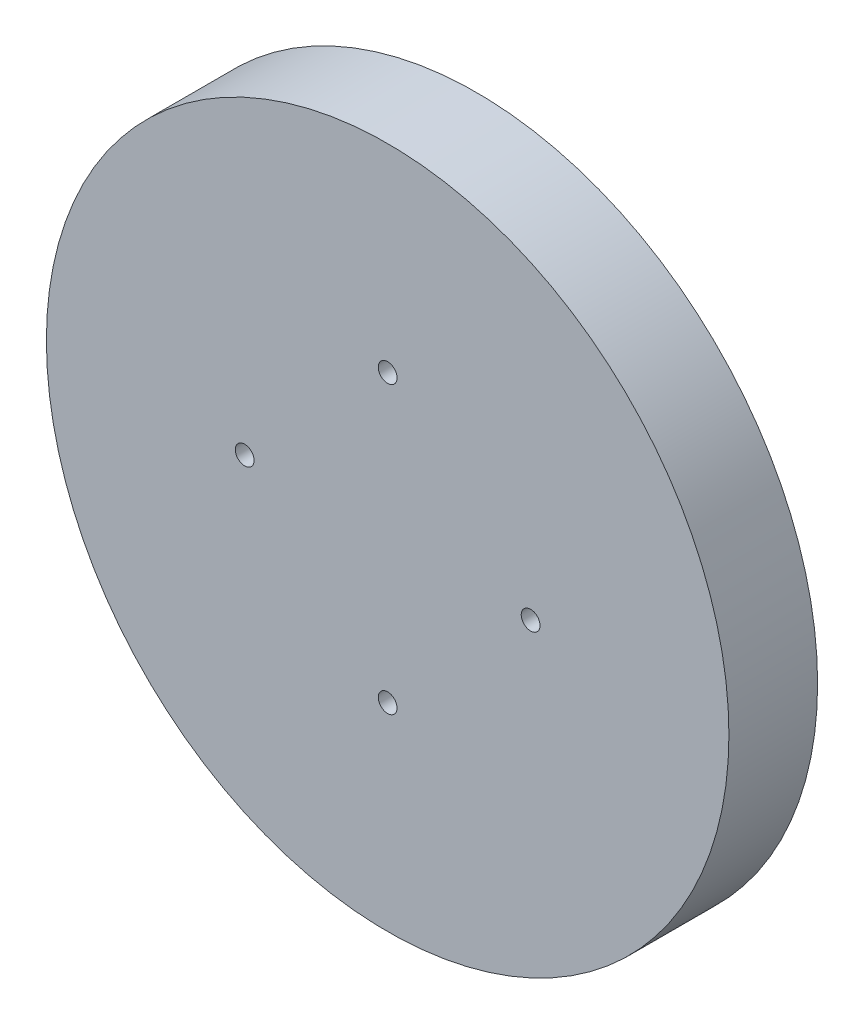
ISO-10303-21;
HEADER;
FILE_DESCRIPTION(('STEP AP214'),'2;1');
FILE_NAME('part.step','',(''),(''),'','','');
FILE_SCHEMA(('AUTOMOTIVE_DESIGN { 1 0 10303 214 1 1 1 1 }'));
ENDSEC;
DATA;
#1=APPLICATION_CONTEXT('core data for automotive mechanical design processes');
#2=APPLICATION_PROTOCOL_DEFINITION('international standard','automotive_design',2000,#1);
#3=PRODUCT_CONTEXT('',#1,'mechanical');
#4=PRODUCT('Part','Part','',(#3));
#5=PRODUCT_RELATED_PRODUCT_CATEGORY('part','',(#4));
#6=PRODUCT_DEFINITION_FORMATION('','',#4);
#7=PRODUCT_DEFINITION_CONTEXT('part definition',#1,'design');
#8=PRODUCT_DEFINITION('design','',#6,#7);
#9=PRODUCT_DEFINITION_SHAPE('','',#8);
#10=(LENGTH_UNIT() NAMED_UNIT(*) SI_UNIT(.MILLI.,.METRE.));
#11=(NAMED_UNIT(*) PLANE_ANGLE_UNIT() SI_UNIT($,.RADIAN.));
#12=(NAMED_UNIT(*) SI_UNIT($,.STERADIAN.) SOLID_ANGLE_UNIT());
#13=UNCERTAINTY_MEASURE_WITH_UNIT(LENGTH_MEASURE(1.E-05),#10,'distance_accuracy_value','');
#14=(GEOMETRIC_REPRESENTATION_CONTEXT(3) GLOBAL_UNCERTAINTY_ASSIGNED_CONTEXT((#13)) GLOBAL_UNIT_ASSIGNED_CONTEXT((#10,
#11,#12)) REPRESENTATION_CONTEXT('',''));
#15=CARTESIAN_POINT('',(0.,0.,0.));
#16=DIRECTION('',(0.,0.,1.));
#17=DIRECTION('',(1.,0.,0.));
#18=AXIS2_PLACEMENT_3D('',#15,#16,#17);
#19=CARTESIAN_POINT('',(0.,0.,5.));
#20=DIRECTION('',(0.,0.,-1.));
#21=DIRECTION('',(-1.,0.,0.));
#22=AXIS2_PLACEMENT_3D('',#19,#20,#21);
#23=CYLINDRICAL_SURFACE('',#22,19.24);
#24=CARTESIAN_POINT('',(0.,0.,5.));
#25=DIRECTION('',(0.,0.,1.));
#26=DIRECTION('',(1.,0.,0.));
#27=AXIS2_PLACEMENT_3D('',#24,#25,#26);
#28=CIRCLE('',#27,19.24);
#29=CARTESIAN_POINT('',(19.24,0.,5.));
#30=VERTEX_POINT('',#29);
#31=EDGE_CURVE('E10',#30,#30,#28,.T.);
#32=ORIENTED_EDGE('',*,*,#31,.F.);
#33=EDGE_LOOP('',(#32));
#34=FACE_BOUND('',#33,.T.);
#35=CARTESIAN_POINT('',(0.,0.,0.));
#36=DIRECTION('',(0.,0.,1.));
#37=DIRECTION('',(1.,0.,0.));
#38=AXIS2_PLACEMENT_3D('',#35,#36,#37);
#39=CIRCLE('',#38,19.24);
#40=CARTESIAN_POINT('',(19.24,0.,0.));
#41=VERTEX_POINT('',#40);
#42=EDGE_CURVE('E42',#41,#41,#39,.T.);
#43=ORIENTED_EDGE('',*,*,#42,.T.);
#44=EDGE_LOOP('',(#43));
#45=FACE_BOUND('',#44,.T.);
#46=ADVANCED_FACE('F39',(#34,#45),#23,.T.);
#47=CARTESIAN_POINT('',(0.,0.,5.));
#48=DIRECTION('',(0.,0.,1.));
#49=DIRECTION('',(1.,0.,0.));
#50=AXIS2_PLACEMENT_3D('',#47,#48,#49);
#51=PLANE('',#50);
#52=CARTESIAN_POINT('',(8.06,0.,5.));
#53=DIRECTION('',(0.,0.,1.));
#54=DIRECTION('',(0.,-1.,0.));
#55=AXIS2_PLACEMENT_3D('',#52,#53,#54);
#56=CIRCLE('',#55,0.53);
#57=CARTESIAN_POINT('',(8.06,-0.530000000000028,5.));
#58=VERTEX_POINT('',#57);
#59=EDGE_CURVE('E60',#58,#58,#56,.T.);
#60=ORIENTED_EDGE('',*,*,#59,.F.);
#61=EDGE_LOOP('',(#60));
#62=FACE_BOUND('',#61,.T.);
#63=CARTESIAN_POINT('',(0.,-8.06,5.));
#64=DIRECTION('',(0.,0.,1.));
#65=DIRECTION('',(-1.,0.,0.));
#66=AXIS2_PLACEMENT_3D('',#63,#64,#65);
#67=CIRCLE('',#66,0.53);
#68=CARTESIAN_POINT('',(-0.53,-8.06,5.));
#69=VERTEX_POINT('',#68);
#70=EDGE_CURVE('E70',#69,#69,#67,.T.);
#71=ORIENTED_EDGE('',*,*,#70,.F.);
#72=EDGE_LOOP('',(#71));
#73=FACE_BOUND('',#72,.T.);
#74=CARTESIAN_POINT('',(-8.06,0.,5.));
#75=DIRECTION('',(0.,0.,1.));
#76=DIRECTION('',(0.,1.,0.));
#77=AXIS2_PLACEMENT_3D('',#74,#75,#76);
#78=CIRCLE('',#77,0.53);
#79=CARTESIAN_POINT('',(-8.06,0.530000000000085,5.));
#80=VERTEX_POINT('',#79);
#81=EDGE_CURVE('E61',#80,#80,#78,.T.);
#82=ORIENTED_EDGE('',*,*,#81,.F.);
#83=EDGE_LOOP('',(#82));
#84=FACE_BOUND('',#83,.T.);
#85=CARTESIAN_POINT('',(0.,8.06,5.));
#86=DIRECTION('',(0.,0.,1.));
#87=DIRECTION('',(1.,0.,0.));
#88=AXIS2_PLACEMENT_3D('',#85,#86,#87);
#89=CIRCLE('',#88,0.53);
#90=CARTESIAN_POINT('',(0.53,8.06,5.));
#91=VERTEX_POINT('',#90);
#92=EDGE_CURVE('E56',#91,#91,#89,.T.);
#93=ORIENTED_EDGE('',*,*,#92,.F.);
#94=EDGE_LOOP('',(#93));
#95=FACE_BOUND('',#94,.T.);
#96=ORIENTED_EDGE('',*,*,#31,.T.);
#97=EDGE_LOOP('',(#96));
#98=FACE_BOUND('',#97,.T.);
#99=ADVANCED_FACE('F92',(#62,#73,#84,#95,#98),#51,.T.);
#100=CARTESIAN_POINT('',(0.,0.,0.));
#101=DIRECTION('',(0.,0.,1.));
#102=DIRECTION('',(1.,0.,0.));
#103=AXIS2_PLACEMENT_3D('',#100,#101,#102);
#104=PLANE('',#103);
#105=CARTESIAN_POINT('',(8.06,0.,0.));
#106=DIRECTION('',(0.,0.,1.));
#107=DIRECTION('',(0.,-1.,0.));
#108=AXIS2_PLACEMENT_3D('',#105,#106,#107);
#109=CIRCLE('',#108,0.53);
#110=CARTESIAN_POINT('',(8.06,-0.530000000000028,0.));
#111=VERTEX_POINT('',#110);
#112=EDGE_CURVE('E74',#111,#111,#109,.F.);
#113=ORIENTED_EDGE('',*,*,#112,.F.);
#114=EDGE_LOOP('',(#113));
#115=FACE_BOUND('',#114,.T.);
#116=CARTESIAN_POINT('',(0.,-8.06,0.));
#117=DIRECTION('',(0.,0.,1.));
#118=DIRECTION('',(-1.,0.,0.));
#119=AXIS2_PLACEMENT_3D('',#116,#117,#118);
#120=CIRCLE('',#119,0.53);
#121=CARTESIAN_POINT('',(-0.53,-8.06,0.));
#122=VERTEX_POINT('',#121);
#123=EDGE_CURVE('E65',#122,#122,#120,.F.);
#124=ORIENTED_EDGE('',*,*,#123,.F.);
#125=EDGE_LOOP('',(#124));
#126=FACE_BOUND('',#125,.T.);
#127=CARTESIAN_POINT('',(-8.06,0.,0.));
#128=DIRECTION('',(0.,0.,1.));
#129=DIRECTION('',(0.,1.,0.));
#130=AXIS2_PLACEMENT_3D('',#127,#128,#129);
#131=CIRCLE('',#130,0.53);
#132=CARTESIAN_POINT('',(-8.06,0.530000000000085,0.));
#133=VERTEX_POINT('',#132);
#134=EDGE_CURVE('E66',#133,#133,#131,.F.);
#135=ORIENTED_EDGE('',*,*,#134,.F.);
#136=EDGE_LOOP('',(#135));
#137=FACE_BOUND('',#136,.T.);
#138=CARTESIAN_POINT('',(0.,8.06,0.));
#139=DIRECTION('',(0.,0.,1.));
#140=DIRECTION('',(1.,0.,0.));
#141=AXIS2_PLACEMENT_3D('',#138,#139,#140);
#142=CIRCLE('',#141,0.53);
#143=CARTESIAN_POINT('',(0.53,8.06,0.));
#144=VERTEX_POINT('',#143);
#145=EDGE_CURVE('E51',#144,#144,#142,.F.);
#146=ORIENTED_EDGE('',*,*,#145,.F.);
#147=EDGE_LOOP('',(#146));
#148=FACE_BOUND('',#147,.T.);
#149=ORIENTED_EDGE('',*,*,#42,.F.);
#150=EDGE_LOOP('',(#149));
#151=FACE_BOUND('',#150,.T.);
#152=ADVANCED_FACE('F88',(#115,#126,#137,#148,#151),#104,.F.);
#153=CARTESIAN_POINT('',(0.,8.06,-1.49906637611548));
#154=DIRECTION('',(0.,0.,1.));
#155=DIRECTION('',(1.,0.,0.));
#156=AXIS2_PLACEMENT_3D('',#153,#154,#155);
#157=CYLINDRICAL_SURFACE('',#156,0.53);
#158=ORIENTED_EDGE('',*,*,#145,.T.);
#159=EDGE_LOOP('',(#158));
#160=FACE_BOUND('',#159,.T.);
#161=ORIENTED_EDGE('',*,*,#92,.T.);
#162=EDGE_LOOP('',(#161));
#163=FACE_BOUND('',#162,.T.);
#164=ADVANCED_FACE('F91',(#160,#163),#157,.F.);
#165=CARTESIAN_POINT('',(-8.06,0.,-1.49906637611548));
#166=DIRECTION('',(0.,0.,1.));
#167=DIRECTION('',(0.,1.,0.));
#168=AXIS2_PLACEMENT_3D('',#165,#166,#167);
#169=CYLINDRICAL_SURFACE('',#168,0.53);
#170=ORIENTED_EDGE('',*,*,#134,.T.);
#171=EDGE_LOOP('',(#170));
#172=FACE_BOUND('',#171,.T.);
#173=ORIENTED_EDGE('',*,*,#81,.T.);
#174=EDGE_LOOP('',(#173));
#175=FACE_BOUND('',#174,.T.);
#176=ADVANCED_FACE('F115',(#172,#175),#169,.F.);
#177=CARTESIAN_POINT('',(0.,-8.06,-1.49906637611548));
#178=DIRECTION('',(0.,0.,1.));
#179=DIRECTION('',(-1.,0.,0.));
#180=AXIS2_PLACEMENT_3D('',#177,#178,#179);
#181=CYLINDRICAL_SURFACE('',#180,0.53);
#182=ORIENTED_EDGE('',*,*,#123,.T.);
#183=EDGE_LOOP('',(#182));
#184=FACE_BOUND('',#183,.T.);
#185=ORIENTED_EDGE('',*,*,#70,.T.);
#186=EDGE_LOOP('',(#185));
#187=FACE_BOUND('',#186,.T.);
#188=ADVANCED_FACE('F119',(#184,#187),#181,.F.);
#189=CARTESIAN_POINT('',(8.06,0.,-1.49906637611548));
#190=DIRECTION('',(0.,0.,1.));
#191=DIRECTION('',(0.,-1.,0.));
#192=AXIS2_PLACEMENT_3D('',#189,#190,#191);
#193=CYLINDRICAL_SURFACE('',#192,0.53);
#194=ORIENTED_EDGE('',*,*,#112,.T.);
#195=EDGE_LOOP('',(#194));
#196=FACE_BOUND('',#195,.T.);
#197=ORIENTED_EDGE('',*,*,#59,.T.);
#198=EDGE_LOOP('',(#197));
#199=FACE_BOUND('',#198,.T.);
#200=ADVANCED_FACE('F85',(#196,#199),#193,.F.);
#201=CLOSED_SHELL('',(#46,#99,#152,#164,#176,#188,#200));
#202=MANIFOLD_SOLID_BREP('B2',#201);
#203=ADVANCED_BREP_SHAPE_REPRESENTATION('',(#18,#202),#14);
#204=SHAPE_DEFINITION_REPRESENTATION(#9,#203);
ENDSEC;
END-ISO-10303-21;
